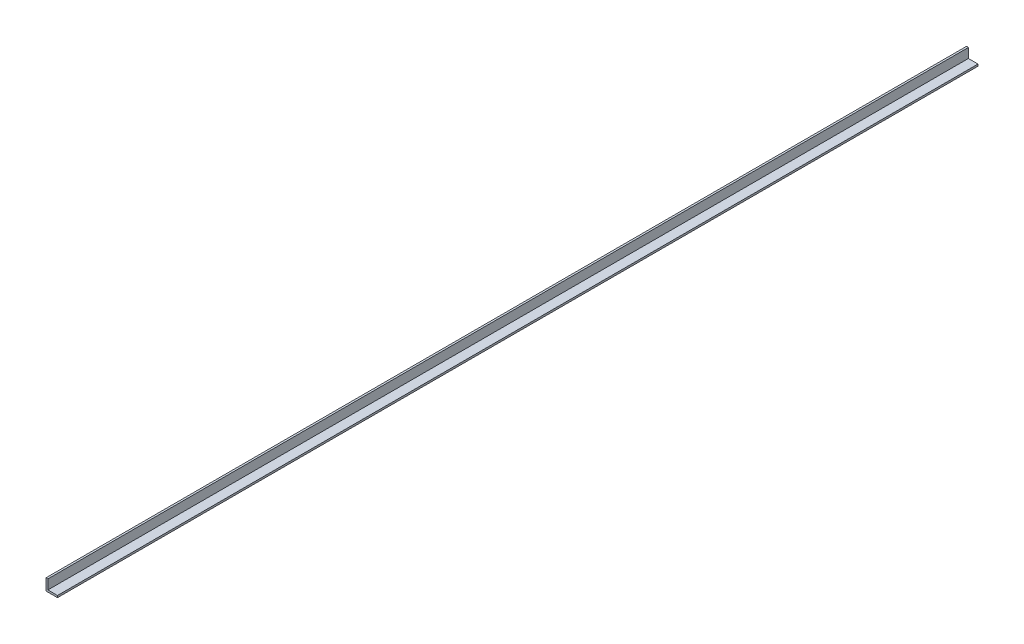
ISO-10303-21;
HEADER;
FILE_DESCRIPTION(('STEP AP214'),'2;1');
FILE_NAME('part.step','',(''),(''),'','','');
FILE_SCHEMA(('AUTOMOTIVE_DESIGN { 1 0 10303 214 1 1 1 1 }'));
ENDSEC;
DATA;
#1=APPLICATION_CONTEXT('core data for automotive mechanical design processes');
#2=APPLICATION_PROTOCOL_DEFINITION('international standard','automotive_design',2000,#1);
#3=PRODUCT_CONTEXT('',#1,'mechanical');
#4=PRODUCT('Part','Part','',(#3));
#5=PRODUCT_RELATED_PRODUCT_CATEGORY('part','',(#4));
#6=PRODUCT_DEFINITION_FORMATION('','',#4);
#7=PRODUCT_DEFINITION_CONTEXT('part definition',#1,'design');
#8=PRODUCT_DEFINITION('design','',#6,#7);
#9=PRODUCT_DEFINITION_SHAPE('','',#8);
#10=(LENGTH_UNIT() NAMED_UNIT(*) SI_UNIT(.MILLI.,.METRE.));
#11=(NAMED_UNIT(*) PLANE_ANGLE_UNIT() SI_UNIT($,.RADIAN.));
#12=(NAMED_UNIT(*) SI_UNIT($,.STERADIAN.) SOLID_ANGLE_UNIT());
#13=UNCERTAINTY_MEASURE_WITH_UNIT(LENGTH_MEASURE(1.E-05),#10,'distance_accuracy_value','');
#14=(GEOMETRIC_REPRESENTATION_CONTEXT(3) GLOBAL_UNCERTAINTY_ASSIGNED_CONTEXT((#13)) GLOBAL_UNIT_ASSIGNED_CONTEXT((#10,
#11,#12)) REPRESENTATION_CONTEXT('',''));
#15=CARTESIAN_POINT('',(0.,0.,0.));
#16=DIRECTION('',(0.,0.,1.));
#17=DIRECTION('',(1.,0.,0.));
#18=AXIS2_PLACEMENT_3D('',#15,#16,#17);
#19=CARTESIAN_POINT('',(12.7,76.2,-6100.));
#20=DIRECTION('',(0.,1.,0.));
#21=DIRECTION('',(0.,0.,1.));
#22=AXIS2_PLACEMENT_3D('',#19,#20,#21);
#23=PLANE('',#22);
#24=DIRECTION('',(-1.,0.,0.));
#25=VECTOR('',#24,1.);
#26=CARTESIAN_POINT('',(12.7,76.2,0.));
#27=LINE('',#26,#25);
#28=CARTESIAN_POINT('',(12.7,76.2,0.));
#29=VERTEX_POINT('',#28);
#30=CARTESIAN_POINT('',(0.,76.2,0.));
#31=VERTEX_POINT('',#30);
#32=EDGE_CURVE('E118',#29,#31,#27,.T.);
#33=ORIENTED_EDGE('',*,*,#32,.F.);
#34=DIRECTION('',(0.,0.,1.));
#35=VECTOR('',#34,1.);
#36=CARTESIAN_POINT('',(12.7,76.2,-6100.));
#37=LINE('',#36,#35);
#38=CARTESIAN_POINT('',(12.7,76.2,-6100.));
#39=VERTEX_POINT('',#38);
#40=EDGE_CURVE('E11',#39,#29,#37,.T.);
#41=ORIENTED_EDGE('',*,*,#40,.F.);
#42=DIRECTION('',(-1.,0.,0.));
#43=VECTOR('',#42,1.);
#44=CARTESIAN_POINT('',(12.7,76.2,-6100.));
#45=LINE('',#44,#43);
#46=CARTESIAN_POINT('',(0.,76.2,-6100.));
#47=VERTEX_POINT('',#46);
#48=EDGE_CURVE('E132',#39,#47,#45,.T.);
#49=ORIENTED_EDGE('',*,*,#48,.T.);
#50=DIRECTION('',(0.,0.,1.));
#51=VECTOR('',#50,1.);
#52=CARTESIAN_POINT('',(0.,76.2,-6100.));
#53=LINE('',#52,#51);
#54=EDGE_CURVE('E36',#47,#31,#53,.T.);
#55=ORIENTED_EDGE('',*,*,#54,.T.);
#56=EDGE_LOOP('',(#33,#41,#49,#55));
#57=FACE_BOUND('',#56,.T.);
#58=ADVANCED_FACE('F33',(#57),#23,.T.);
#59=CARTESIAN_POINT('',(12.7,12.7,-6100.));
#60=DIRECTION('',(1.,0.,0.));
#61=DIRECTION('',(0.,1.,0.));
#62=AXIS2_PLACEMENT_3D('',#59,#60,#61);
#63=PLANE('',#62);
#64=DIRECTION('',(0.,1.,0.));
#65=VECTOR('',#64,1.);
#66=CARTESIAN_POINT('',(12.7,12.7,0.));
#67=LINE('',#66,#65);
#68=CARTESIAN_POINT('',(12.7,12.7,0.));
#69=VERTEX_POINT('',#68);
#70=EDGE_CURVE('E130',#69,#29,#67,.T.);
#71=ORIENTED_EDGE('',*,*,#70,.F.);
#72=DIRECTION('',(0.,0.,1.));
#73=VECTOR('',#72,1.);
#74=CARTESIAN_POINT('',(12.7,12.7,-6100.));
#75=LINE('',#74,#73);
#76=CARTESIAN_POINT('',(12.7,12.7,-6100.));
#77=VERTEX_POINT('',#76);
#78=EDGE_CURVE('E42',#77,#69,#75,.T.);
#79=ORIENTED_EDGE('',*,*,#78,.F.);
#80=DIRECTION('',(0.,1.,0.));
#81=VECTOR('',#80,1.);
#82=CARTESIAN_POINT('',(12.7,12.7,-6100.));
#83=LINE('',#82,#81);
#84=EDGE_CURVE('E108',#77,#39,#83,.T.);
#85=ORIENTED_EDGE('',*,*,#84,.T.);
#86=ORIENTED_EDGE('',*,*,#40,.T.);
#87=EDGE_LOOP('',(#71,#79,#85,#86));
#88=FACE_BOUND('',#87,.T.);
#89=ADVANCED_FACE('F140',(#88),#63,.T.);
#90=CARTESIAN_POINT('',(76.2,12.7,-6100.));
#91=DIRECTION('',(0.,1.,0.));
#92=DIRECTION('',(-1.,0.,0.));
#93=AXIS2_PLACEMENT_3D('',#90,#91,#92);
#94=PLANE('',#93);
#95=DIRECTION('',(-1.,0.,0.));
#96=VECTOR('',#95,1.);
#97=CARTESIAN_POINT('',(76.2,12.7,0.));
#98=LINE('',#97,#96);
#99=CARTESIAN_POINT('',(76.2,12.7,0.));
#100=VERTEX_POINT('',#99);
#101=EDGE_CURVE('E95',#100,#69,#98,.T.);
#102=ORIENTED_EDGE('',*,*,#101,.F.);
#103=DIRECTION('',(0.,0.,1.));
#104=VECTOR('',#103,1.);
#105=CARTESIAN_POINT('',(76.2,12.7,-6100.));
#106=LINE('',#105,#104);
#107=CARTESIAN_POINT('',(76.2,12.7,-6100.));
#108=VERTEX_POINT('',#107);
#109=EDGE_CURVE('E90',#108,#100,#106,.T.);
#110=ORIENTED_EDGE('',*,*,#109,.F.);
#111=DIRECTION('',(-1.,0.,0.));
#112=VECTOR('',#111,1.);
#113=CARTESIAN_POINT('',(76.2,12.7,-6100.));
#114=LINE('',#113,#112);
#115=EDGE_CURVE('E93',#108,#77,#114,.T.);
#116=ORIENTED_EDGE('',*,*,#115,.T.);
#117=ORIENTED_EDGE('',*,*,#78,.T.);
#118=EDGE_LOOP('',(#102,#110,#116,#117));
#119=FACE_BOUND('',#118,.T.);
#120=ADVANCED_FACE('F92',(#119),#94,.T.);
#121=CARTESIAN_POINT('',(76.2,0.,-6100.));
#122=DIRECTION('',(1.,0.,0.));
#123=DIRECTION('',(0.,0.,-1.));
#124=AXIS2_PLACEMENT_3D('',#121,#122,#123);
#125=PLANE('',#124);
#126=DIRECTION('',(0.,1.,0.));
#127=VECTOR('',#126,1.);
#128=CARTESIAN_POINT('',(76.2,0.,0.));
#129=LINE('',#128,#127);
#130=CARTESIAN_POINT('',(76.2,0.,0.));
#131=VERTEX_POINT('',#130);
#132=EDGE_CURVE('E127',#131,#100,#129,.T.);
#133=ORIENTED_EDGE('',*,*,#132,.F.);
#134=DIRECTION('',(0.,0.,1.));
#135=VECTOR('',#134,1.);
#136=CARTESIAN_POINT('',(76.2,0.,-6100.));
#137=LINE('',#136,#135);
#138=CARTESIAN_POINT('',(76.2,0.,-6100.));
#139=VERTEX_POINT('',#138);
#140=EDGE_CURVE('E100',#139,#131,#137,.T.);
#141=ORIENTED_EDGE('',*,*,#140,.F.);
#142=DIRECTION('',(0.,1.,0.));
#143=VECTOR('',#142,1.);
#144=CARTESIAN_POINT('',(76.2,0.,-6100.));
#145=LINE('',#144,#143);
#146=EDGE_CURVE('E106',#139,#108,#145,.T.);
#147=ORIENTED_EDGE('',*,*,#146,.T.);
#148=ORIENTED_EDGE('',*,*,#109,.T.);
#149=EDGE_LOOP('',(#133,#141,#147,#148));
#150=FACE_BOUND('',#149,.T.);
#151=ADVANCED_FACE('F110',(#150),#125,.T.);
#152=CARTESIAN_POINT('',(0.,0.,-6100.));
#153=DIRECTION('',(0.,-1.,0.));
#154=DIRECTION('',(0.,0.,-1.));
#155=AXIS2_PLACEMENT_3D('',#152,#153,#154);
#156=PLANE('',#155);
#157=DIRECTION('',(1.,0.,0.));
#158=VECTOR('',#157,1.);
#159=CARTESIAN_POINT('',(0.,0.,0.));
#160=LINE('',#159,#158);
#161=CARTESIAN_POINT('',(0.,0.,0.));
#162=VERTEX_POINT('',#161);
#163=EDGE_CURVE('E124',#162,#131,#160,.T.);
#164=ORIENTED_EDGE('',*,*,#163,.F.);
#165=DIRECTION('',(0.,0.,1.));
#166=VECTOR('',#165,1.);
#167=CARTESIAN_POINT('',(0.,0.,-6100.));
#168=LINE('',#167,#166);
#169=CARTESIAN_POINT('',(0.,0.,-6100.));
#170=VERTEX_POINT('',#169);
#171=EDGE_CURVE('E135',#170,#162,#168,.T.);
#172=ORIENTED_EDGE('',*,*,#171,.F.);
#173=DIRECTION('',(1.,0.,0.));
#174=VECTOR('',#173,1.);
#175=CARTESIAN_POINT('',(0.,0.,-6100.));
#176=LINE('',#175,#174);
#177=EDGE_CURVE('E111',#170,#139,#176,.T.);
#178=ORIENTED_EDGE('',*,*,#177,.T.);
#179=ORIENTED_EDGE('',*,*,#140,.T.);
#180=EDGE_LOOP('',(#164,#172,#178,#179));
#181=FACE_BOUND('',#180,.T.);
#182=ADVANCED_FACE('F153',(#181),#156,.T.);
#183=CARTESIAN_POINT('',(0.,76.2,-6100.));
#184=DIRECTION('',(-1.,0.,0.));
#185=DIRECTION('',(0.,-1.,0.));
#186=AXIS2_PLACEMENT_3D('',#183,#184,#185);
#187=PLANE('',#186);
#188=DIRECTION('',(0.,-1.,0.));
#189=VECTOR('',#188,1.);
#190=CARTESIAN_POINT('',(0.,76.2,0.));
#191=LINE('',#190,#189);
#192=EDGE_CURVE('E121',#31,#162,#191,.T.);
#193=ORIENTED_EDGE('',*,*,#192,.F.);
#194=ORIENTED_EDGE('',*,*,#54,.F.);
#195=DIRECTION('',(0.,-1.,0.));
#196=VECTOR('',#195,1.);
#197=CARTESIAN_POINT('',(0.,76.2,-6100.));
#198=LINE('',#197,#196);
#199=EDGE_CURVE('E113',#47,#170,#198,.T.);
#200=ORIENTED_EDGE('',*,*,#199,.T.);
#201=ORIENTED_EDGE('',*,*,#171,.T.);
#202=EDGE_LOOP('',(#193,#194,#200,#201));
#203=FACE_BOUND('',#202,.T.);
#204=ADVANCED_FACE('F137',(#203),#187,.T.);
#205=CARTESIAN_POINT('',(0.,0.,-6100.));
#206=DIRECTION('',(0.,0.,1.));
#207=DIRECTION('',(1.,0.,0.));
#208=AXIS2_PLACEMENT_3D('',#205,#206,#207);
#209=PLANE('',#208);
#210=ORIENTED_EDGE('',*,*,#48,.F.);
#211=ORIENTED_EDGE('',*,*,#84,.F.);
#212=ORIENTED_EDGE('',*,*,#115,.F.);
#213=ORIENTED_EDGE('',*,*,#146,.F.);
#214=ORIENTED_EDGE('',*,*,#177,.F.);
#215=ORIENTED_EDGE('',*,*,#199,.F.);
#216=EDGE_LOOP('',(#210,#211,#212,#213,#214,#215));
#217=FACE_BOUND('',#216,.T.);
#218=ADVANCED_FACE('F104',(#217),#209,.F.);
#219=CARTESIAN_POINT('',(0.,0.,0.));
#220=DIRECTION('',(0.,0.,1.));
#221=DIRECTION('',(1.,0.,0.));
#222=AXIS2_PLACEMENT_3D('',#219,#220,#221);
#223=PLANE('',#222);
#224=ORIENTED_EDGE('',*,*,#32,.T.);
#225=ORIENTED_EDGE('',*,*,#192,.T.);
#226=ORIENTED_EDGE('',*,*,#163,.T.);
#227=ORIENTED_EDGE('',*,*,#132,.T.);
#228=ORIENTED_EDGE('',*,*,#101,.T.);
#229=ORIENTED_EDGE('',*,*,#70,.T.);
#230=EDGE_LOOP('',(#224,#225,#226,#227,#228,#229));
#231=FACE_BOUND('',#230,.T.);
#232=ADVANCED_FACE('F139',(#231),#223,.T.);
#233=CLOSED_SHELL('',(#58,#89,#120,#151,#182,#204,#218,#232));
#234=MANIFOLD_SOLID_BREP('B2',#233);
#235=ADVANCED_BREP_SHAPE_REPRESENTATION('',(#18,#234),#14);
#236=SHAPE_DEFINITION_REPRESENTATION(#9,#235);
ENDSEC;
END-ISO-10303-21;
